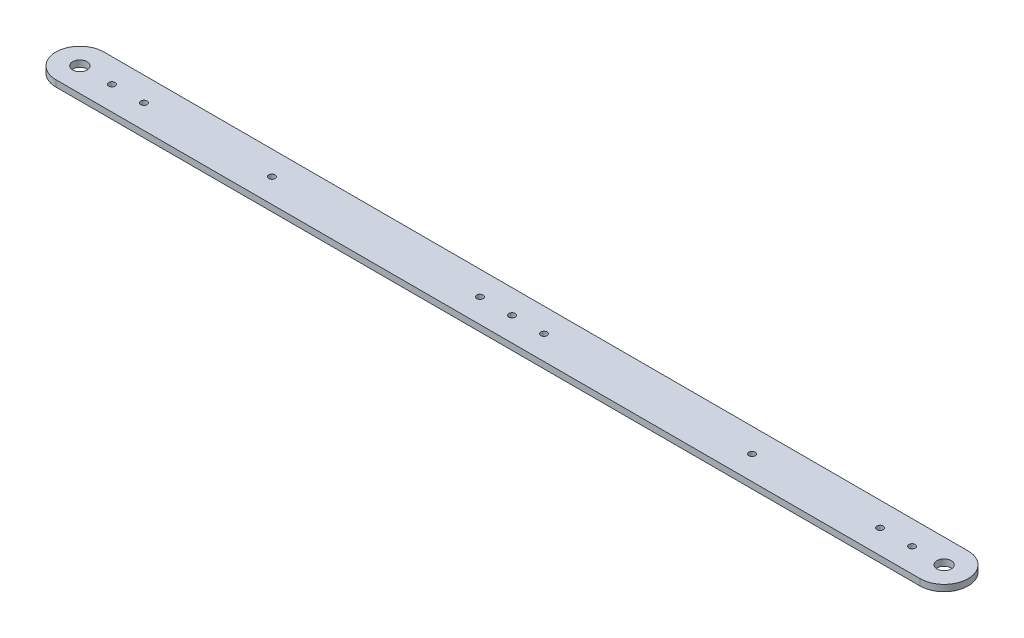
ISO-10303-21;
HEADER;
FILE_DESCRIPTION(('STEP AP214'),'2;1');
FILE_NAME('part.step','',(''),(''),'','','');
FILE_SCHEMA(('AUTOMOTIVE_DESIGN { 1 0 10303 214 1 1 1 1 }'));
ENDSEC;
DATA;
#1=APPLICATION_CONTEXT('core data for automotive mechanical design processes');
#2=APPLICATION_PROTOCOL_DEFINITION('international standard','automotive_design',2000,#1);
#3=PRODUCT_CONTEXT('',#1,'mechanical');
#4=PRODUCT('Part','Part','',(#3));
#5=PRODUCT_RELATED_PRODUCT_CATEGORY('part','',(#4));
#6=PRODUCT_DEFINITION_FORMATION('','',#4);
#7=PRODUCT_DEFINITION_CONTEXT('part definition',#1,'design');
#8=PRODUCT_DEFINITION('design','',#6,#7);
#9=PRODUCT_DEFINITION_SHAPE('','',#8);
#10=(LENGTH_UNIT() NAMED_UNIT(*) SI_UNIT(.MILLI.,.METRE.));
#11=(NAMED_UNIT(*) PLANE_ANGLE_UNIT() SI_UNIT($,.RADIAN.));
#12=(NAMED_UNIT(*) SI_UNIT($,.STERADIAN.) SOLID_ANGLE_UNIT());
#13=UNCERTAINTY_MEASURE_WITH_UNIT(LENGTH_MEASURE(1.E-05),#10,'distance_accuracy_value','');
#14=(GEOMETRIC_REPRESENTATION_CONTEXT(3) GLOBAL_UNCERTAINTY_ASSIGNED_CONTEXT((#13)) GLOBAL_UNIT_ASSIGNED_CONTEXT((#10,
#11,#12)) REPRESENTATION_CONTEXT('',''));
#15=CARTESIAN_POINT('',(0.,0.,0.));
#16=DIRECTION('',(0.,0.,1.));
#17=DIRECTION('',(1.,0.,0.));
#18=AXIS2_PLACEMENT_3D('',#15,#16,#17);
#19=CARTESIAN_POINT('',(-270.,4.,0.));
#20=DIRECTION('',(0.,-1.,0.));
#21=DIRECTION('',(0.,0.,-1.));
#22=AXIS2_PLACEMENT_3D('',#19,#20,#21);
#23=PLANE('',#22);
#24=CARTESIAN_POINT('',(-270.,4.,0.));
#25=DIRECTION('',(0.,1.,0.));
#26=DIRECTION('',(0.,0.,-1.));
#27=AXIS2_PLACEMENT_3D('',#24,#25,#26);
#28=CIRCLE('',#27,15.);
#29=CARTESIAN_POINT('',(-270.,4.,-15.));
#30=VERTEX_POINT('',#29);
#31=CARTESIAN_POINT('',(-270.,4.,15.0000000000001));
#32=VERTEX_POINT('',#31);
#33=EDGE_CURVE('E84',#30,#32,#28,.T.);
#34=ORIENTED_EDGE('',*,*,#33,.T.);
#35=DIRECTION('',(1.,0.,0.));
#36=VECTOR('',#35,1.);
#37=CARTESIAN_POINT('',(270.,4.,15.));
#38=LINE('',#37,#36);
#39=CARTESIAN_POINT('',(270.,4.,15.));
#40=VERTEX_POINT('',#39);
#41=EDGE_CURVE('E79',#32,#40,#38,.T.);
#42=ORIENTED_EDGE('',*,*,#41,.T.);
#43=CARTESIAN_POINT('',(270.,4.,0.));
#44=DIRECTION('',(0.,1.,0.));
#45=DIRECTION('',(0.,0.,-1.));
#46=AXIS2_PLACEMENT_3D('',#43,#44,#45);
#47=CIRCLE('',#46,15.);
#48=CARTESIAN_POINT('',(270.,4.,-15.));
#49=VERTEX_POINT('',#48);
#50=EDGE_CURVE('E82',#40,#49,#47,.T.);
#51=ORIENTED_EDGE('',*,*,#50,.T.);
#52=DIRECTION('',(-1.,0.,0.));
#53=VECTOR('',#52,1.);
#54=CARTESIAN_POINT('',(-270.,4.,-15.));
#55=LINE('',#54,#53);
#56=EDGE_CURVE('E49',#49,#30,#55,.T.);
#57=ORIENTED_EDGE('',*,*,#56,.T.);
#58=EDGE_LOOP('',(#34,#42,#51,#57));
#59=FACE_BOUND('',#58,.T.);
#60=CARTESIAN_POINT('',(-270.,4.,0.));
#61=DIRECTION('',(0.,1.,0.));
#62=DIRECTION('',(0.,0.,1.));
#63=AXIS2_PLACEMENT_3D('',#60,#61,#62);
#64=CIRCLE('',#63,4.50000000000003);
#65=CARTESIAN_POINT('',(-270.,4.,4.50000000000006));
#66=VERTEX_POINT('',#65);
#67=EDGE_CURVE('E99',#66,#66,#64,.T.);
#68=ORIENTED_EDGE('',*,*,#67,.F.);
#69=EDGE_LOOP('',(#68));
#70=FACE_BOUND('',#69,.T.);
#71=CARTESIAN_POINT('',(150.,4.,0.));
#72=DIRECTION('',(0.,1.,0.));
#73=DIRECTION('',(0.,0.,1.));
#74=AXIS2_PLACEMENT_3D('',#71,#72,#73);
#75=CIRCLE('',#74,2.);
#76=CARTESIAN_POINT('',(150.,4.,2.));
#77=VERTEX_POINT('',#76);
#78=EDGE_CURVE('E114',#77,#77,#75,.T.);
#79=ORIENTED_EDGE('',*,*,#78,.F.);
#80=EDGE_LOOP('',(#79));
#81=FACE_BOUND('',#80,.T.);
#82=CARTESIAN_POINT('',(270.,4.,0.));
#83=DIRECTION('',(0.,1.,0.));
#84=DIRECTION('',(0.,0.,1.));
#85=AXIS2_PLACEMENT_3D('',#82,#83,#84);
#86=CIRCLE('',#85,4.50000000000001);
#87=CARTESIAN_POINT('',(270.,4.,4.49999999999998));
#88=VERTEX_POINT('',#87);
#89=EDGE_CURVE('E120',#88,#88,#86,.T.);
#90=ORIENTED_EDGE('',*,*,#89,.F.);
#91=EDGE_LOOP('',(#90));
#92=FACE_BOUND('',#91,.T.);
#93=CARTESIAN_POINT('',(0.,4.,0.));
#94=DIRECTION('',(0.,1.,0.));
#95=DIRECTION('',(0.,0.,1.));
#96=AXIS2_PLACEMENT_3D('',#93,#94,#95);
#97=CIRCLE('',#96,2.);
#98=CARTESIAN_POINT('',(0.,4.,2.));
#99=VERTEX_POINT('',#98);
#100=EDGE_CURVE('E126',#99,#99,#97,.T.);
#101=ORIENTED_EDGE('',*,*,#100,.F.);
#102=EDGE_LOOP('',(#101));
#103=FACE_BOUND('',#102,.T.);
#104=CARTESIAN_POINT('',(-250.,4.,0.));
#105=DIRECTION('',(0.,1.,0.));
#106=DIRECTION('',(0.,0.,1.));
#107=AXIS2_PLACEMENT_3D('',#104,#105,#106);
#108=CIRCLE('',#107,2.);
#109=CARTESIAN_POINT('',(-250.,4.,2.00000000000003));
#110=VERTEX_POINT('',#109);
#111=EDGE_CURVE('E132',#110,#110,#108,.T.);
#112=ORIENTED_EDGE('',*,*,#111,.F.);
#113=EDGE_LOOP('',(#112));
#114=FACE_BOUND('',#113,.T.);
#115=CARTESIAN_POINT('',(-150.,4.,0.));
#116=DIRECTION('',(0.,1.,0.));
#117=DIRECTION('',(0.,0.,1.));
#118=AXIS2_PLACEMENT_3D('',#115,#116,#117);
#119=CIRCLE('',#118,2.);
#120=CARTESIAN_POINT('',(-150.,4.,2.00000000000001));
#121=VERTEX_POINT('',#120);
#122=EDGE_CURVE('E138',#121,#121,#119,.T.);
#123=ORIENTED_EDGE('',*,*,#122,.F.);
#124=EDGE_LOOP('',(#123));
#125=FACE_BOUND('',#124,.T.);
#126=CARTESIAN_POINT('',(-230.,4.,0.));
#127=DIRECTION('',(0.,1.,0.));
#128=DIRECTION('',(0.,0.,1.));
#129=AXIS2_PLACEMENT_3D('',#126,#127,#128);
#130=CIRCLE('',#129,2.);
#131=CARTESIAN_POINT('',(-230.,4.,2.00000000000002));
#132=VERTEX_POINT('',#131);
#133=EDGE_CURVE('E144',#132,#132,#130,.T.);
#134=ORIENTED_EDGE('',*,*,#133,.F.);
#135=EDGE_LOOP('',(#134));
#136=FACE_BOUND('',#135,.T.);
#137=CARTESIAN_POINT('',(-20.,4.,0.));
#138=DIRECTION('',(0.,1.,0.));
#139=DIRECTION('',(0.,0.,1.));
#140=AXIS2_PLACEMENT_3D('',#137,#138,#139);
#141=CIRCLE('',#140,2.);
#142=CARTESIAN_POINT('',(-20.,4.,2.));
#143=VERTEX_POINT('',#142);
#144=EDGE_CURVE('E150',#143,#143,#141,.T.);
#145=ORIENTED_EDGE('',*,*,#144,.F.);
#146=EDGE_LOOP('',(#145));
#147=FACE_BOUND('',#146,.T.);
#148=CARTESIAN_POINT('',(230.,4.,0.));
#149=DIRECTION('',(0.,1.,0.));
#150=DIRECTION('',(0.,0.,-1.));
#151=AXIS2_PLACEMENT_3D('',#148,#149,#150);
#152=CIRCLE('',#151,2.);
#153=CARTESIAN_POINT('',(230.,4.,-1.99999999999997));
#154=VERTEX_POINT('',#153);
#155=EDGE_CURVE('E156',#154,#154,#152,.T.);
#156=ORIENTED_EDGE('',*,*,#155,.F.);
#157=EDGE_LOOP('',(#156));
#158=FACE_BOUND('',#157,.T.);
#159=CARTESIAN_POINT('',(250.,4.,0.));
#160=DIRECTION('',(0.,1.,0.));
#161=DIRECTION('',(0.,0.,-1.));
#162=AXIS2_PLACEMENT_3D('',#159,#160,#161);
#163=CIRCLE('',#162,2.);
#164=CARTESIAN_POINT('',(250.,4.,-1.99999999999997));
#165=VERTEX_POINT('',#164);
#166=EDGE_CURVE('E162',#165,#165,#163,.T.);
#167=ORIENTED_EDGE('',*,*,#166,.F.);
#168=EDGE_LOOP('',(#167));
#169=FACE_BOUND('',#168,.T.);
#170=CARTESIAN_POINT('',(20.,4.,0.));
#171=DIRECTION('',(0.,1.,0.));
#172=DIRECTION('',(0.,0.,-1.));
#173=AXIS2_PLACEMENT_3D('',#170,#171,#172);
#174=CIRCLE('',#173,2.);
#175=CARTESIAN_POINT('',(20.,4.,-2.));
#176=VERTEX_POINT('',#175);
#177=EDGE_CURVE('E168',#176,#176,#174,.T.);
#178=ORIENTED_EDGE('',*,*,#177,.F.);
#179=EDGE_LOOP('',(#178));
#180=FACE_BOUND('',#179,.T.);
#181=ADVANCED_FACE('F32',(#59,#70,#81,#92,#103,#114,#125,#136,#147,#158,#169,#180),#23,.F.);
#182=CARTESIAN_POINT('',(-270.,0.,0.));
#183=DIRECTION('',(0.,-1.,0.));
#184=DIRECTION('',(0.,0.,-1.));
#185=AXIS2_PLACEMENT_3D('',#182,#183,#184);
#186=PLANE('',#185);
#187=CARTESIAN_POINT('',(250.,0.,0.));
#188=DIRECTION('',(0.,1.,0.));
#189=DIRECTION('',(0.,0.,-1.));
#190=AXIS2_PLACEMENT_3D('',#187,#188,#189);
#191=CIRCLE('',#190,2.);
#192=CARTESIAN_POINT('',(250.,0.,-1.99999999999997));
#193=VERTEX_POINT('',#192);
#194=EDGE_CURVE('E165',#193,#193,#191,.T.);
#195=ORIENTED_EDGE('',*,*,#194,.T.);
#196=EDGE_LOOP('',(#195));
#197=FACE_BOUND('',#196,.T.);
#198=CARTESIAN_POINT('',(-20.,0.,0.));
#199=DIRECTION('',(0.,1.,0.));
#200=DIRECTION('',(0.,0.,1.));
#201=AXIS2_PLACEMENT_3D('',#198,#199,#200);
#202=CIRCLE('',#201,2.);
#203=CARTESIAN_POINT('',(-20.,0.,2.));
#204=VERTEX_POINT('',#203);
#205=EDGE_CURVE('E153',#204,#204,#202,.T.);
#206=ORIENTED_EDGE('',*,*,#205,.T.);
#207=EDGE_LOOP('',(#206));
#208=FACE_BOUND('',#207,.T.);
#209=CARTESIAN_POINT('',(-150.,0.,0.));
#210=DIRECTION('',(0.,1.,0.));
#211=DIRECTION('',(0.,0.,1.));
#212=AXIS2_PLACEMENT_3D('',#209,#210,#211);
#213=CIRCLE('',#212,2.);
#214=CARTESIAN_POINT('',(-150.,0.,2.00000000000001));
#215=VERTEX_POINT('',#214);
#216=EDGE_CURVE('E141',#215,#215,#213,.T.);
#217=ORIENTED_EDGE('',*,*,#216,.T.);
#218=EDGE_LOOP('',(#217));
#219=FACE_BOUND('',#218,.T.);
#220=CARTESIAN_POINT('',(0.,0.,0.));
#221=DIRECTION('',(0.,1.,0.));
#222=DIRECTION('',(0.,0.,1.));
#223=AXIS2_PLACEMENT_3D('',#220,#221,#222);
#224=CIRCLE('',#223,2.);
#225=CARTESIAN_POINT('',(0.,0.,2.));
#226=VERTEX_POINT('',#225);
#227=EDGE_CURVE('E129',#226,#226,#224,.T.);
#228=ORIENTED_EDGE('',*,*,#227,.T.);
#229=EDGE_LOOP('',(#228));
#230=FACE_BOUND('',#229,.T.);
#231=CARTESIAN_POINT('',(150.,0.,0.));
#232=DIRECTION('',(0.,1.,0.));
#233=DIRECTION('',(0.,0.,1.));
#234=AXIS2_PLACEMENT_3D('',#231,#232,#233);
#235=CIRCLE('',#234,2.);
#236=CARTESIAN_POINT('',(150.,0.,2.));
#237=VERTEX_POINT('',#236);
#238=EDGE_CURVE('E117',#237,#237,#235,.T.);
#239=ORIENTED_EDGE('',*,*,#238,.T.);
#240=EDGE_LOOP('',(#239));
#241=FACE_BOUND('',#240,.T.);
#242=CARTESIAN_POINT('',(-270.,0.,0.));
#243=DIRECTION('',(0.,1.,0.));
#244=DIRECTION('',(0.,0.,-1.));
#245=AXIS2_PLACEMENT_3D('',#242,#243,#244);
#246=CIRCLE('',#245,15.);
#247=CARTESIAN_POINT('',(-270.,0.,-15.));
#248=VERTEX_POINT('',#247);
#249=CARTESIAN_POINT('',(-270.,0.,15.0000000000001));
#250=VERTEX_POINT('',#249);
#251=EDGE_CURVE('E96',#248,#250,#246,.T.);
#252=ORIENTED_EDGE('',*,*,#251,.F.);
#253=DIRECTION('',(-1.,0.,0.));
#254=VECTOR('',#253,1.);
#255=CARTESIAN_POINT('',(-270.,0.,-15.));
#256=LINE('',#255,#254);
#257=CARTESIAN_POINT('',(270.,0.,-15.));
#258=VERTEX_POINT('',#257);
#259=EDGE_CURVE('E72',#258,#248,#256,.T.);
#260=ORIENTED_EDGE('',*,*,#259,.F.);
#261=CARTESIAN_POINT('',(270.,0.,0.));
#262=DIRECTION('',(0.,1.,0.));
#263=DIRECTION('',(0.,0.,-1.));
#264=AXIS2_PLACEMENT_3D('',#261,#262,#263);
#265=CIRCLE('',#264,15.);
#266=CARTESIAN_POINT('',(270.,0.,15.));
#267=VERTEX_POINT('',#266);
#268=EDGE_CURVE('E66',#267,#258,#265,.T.);
#269=ORIENTED_EDGE('',*,*,#268,.F.);
#270=DIRECTION('',(1.,0.,0.));
#271=VECTOR('',#270,1.);
#272=CARTESIAN_POINT('',(270.,0.,15.));
#273=LINE('',#272,#271);
#274=EDGE_CURVE('E88',#250,#267,#273,.T.);
#275=ORIENTED_EDGE('',*,*,#274,.F.);
#276=EDGE_LOOP('',(#252,#260,#269,#275));
#277=FACE_BOUND('',#276,.T.);
#278=CARTESIAN_POINT('',(-270.,0.,0.));
#279=DIRECTION('',(0.,1.,0.));
#280=DIRECTION('',(0.,0.,1.));
#281=AXIS2_PLACEMENT_3D('',#278,#279,#280);
#282=CIRCLE('',#281,4.50000000000003);
#283=CARTESIAN_POINT('',(-270.,0.,4.50000000000006));
#284=VERTEX_POINT('',#283);
#285=EDGE_CURVE('E111',#284,#284,#282,.T.);
#286=ORIENTED_EDGE('',*,*,#285,.T.);
#287=EDGE_LOOP('',(#286));
#288=FACE_BOUND('',#287,.T.);
#289=CARTESIAN_POINT('',(270.,0.,0.));
#290=DIRECTION('',(0.,1.,0.));
#291=DIRECTION('',(0.,0.,1.));
#292=AXIS2_PLACEMENT_3D('',#289,#290,#291);
#293=CIRCLE('',#292,4.50000000000001);
#294=CARTESIAN_POINT('',(270.,0.,4.49999999999998));
#295=VERTEX_POINT('',#294);
#296=EDGE_CURVE('E123',#295,#295,#293,.T.);
#297=ORIENTED_EDGE('',*,*,#296,.T.);
#298=EDGE_LOOP('',(#297));
#299=FACE_BOUND('',#298,.T.);
#300=CARTESIAN_POINT('',(-250.,0.,0.));
#301=DIRECTION('',(0.,1.,0.));
#302=DIRECTION('',(0.,0.,1.));
#303=AXIS2_PLACEMENT_3D('',#300,#301,#302);
#304=CIRCLE('',#303,2.);
#305=CARTESIAN_POINT('',(-250.,0.,2.00000000000003));
#306=VERTEX_POINT('',#305);
#307=EDGE_CURVE('E135',#306,#306,#304,.T.);
#308=ORIENTED_EDGE('',*,*,#307,.T.);
#309=EDGE_LOOP('',(#308));
#310=FACE_BOUND('',#309,.T.);
#311=CARTESIAN_POINT('',(-230.,0.,0.));
#312=DIRECTION('',(0.,1.,0.));
#313=DIRECTION('',(0.,0.,1.));
#314=AXIS2_PLACEMENT_3D('',#311,#312,#313);
#315=CIRCLE('',#314,2.);
#316=CARTESIAN_POINT('',(-230.,0.,2.00000000000002));
#317=VERTEX_POINT('',#316);
#318=EDGE_CURVE('E147',#317,#317,#315,.T.);
#319=ORIENTED_EDGE('',*,*,#318,.T.);
#320=EDGE_LOOP('',(#319));
#321=FACE_BOUND('',#320,.T.);
#322=CARTESIAN_POINT('',(230.,0.,0.));
#323=DIRECTION('',(0.,1.,0.));
#324=DIRECTION('',(0.,0.,-1.));
#325=AXIS2_PLACEMENT_3D('',#322,#323,#324);
#326=CIRCLE('',#325,2.);
#327=CARTESIAN_POINT('',(230.,0.,-1.99999999999997));
#328=VERTEX_POINT('',#327);
#329=EDGE_CURVE('E159',#328,#328,#326,.T.);
#330=ORIENTED_EDGE('',*,*,#329,.T.);
#331=EDGE_LOOP('',(#330));
#332=FACE_BOUND('',#331,.T.);
#333=CARTESIAN_POINT('',(20.,0.,0.));
#334=DIRECTION('',(0.,1.,0.));
#335=DIRECTION('',(0.,0.,-1.));
#336=AXIS2_PLACEMENT_3D('',#333,#334,#335);
#337=CIRCLE('',#336,2.);
#338=CARTESIAN_POINT('',(20.,0.,-2.));
#339=VERTEX_POINT('',#338);
#340=EDGE_CURVE('E171',#339,#339,#337,.T.);
#341=ORIENTED_EDGE('',*,*,#340,.T.);
#342=EDGE_LOOP('',(#341));
#343=FACE_BOUND('',#342,.T.);
#344=ADVANCED_FACE('F107',(#197,#208,#219,#230,#241,#277,#288,#299,#310,#321,#332,#343),#186,.T.);
#345=CARTESIAN_POINT('',(-270.,4.,0.));
#346=DIRECTION('',(0.,-1.,0.));
#347=DIRECTION('',(0.,0.,-1.));
#348=AXIS2_PLACEMENT_3D('',#345,#346,#347);
#349=CYLINDRICAL_SURFACE('',#348,15.);
#350=ORIENTED_EDGE('',*,*,#251,.T.);
#351=DIRECTION('',(0.,-1.,0.));
#352=VECTOR('',#351,1.);
#353=CARTESIAN_POINT('',(-270.,4.,15.0000000000001));
#354=LINE('',#353,#352);
#355=EDGE_CURVE('E11',#32,#250,#354,.T.);
#356=ORIENTED_EDGE('',*,*,#355,.F.);
#357=ORIENTED_EDGE('',*,*,#33,.F.);
#358=DIRECTION('',(0.,-1.,0.));
#359=VECTOR('',#358,1.);
#360=CARTESIAN_POINT('',(-270.,4.,-15.));
#361=LINE('',#360,#359);
#362=EDGE_CURVE('E92',#30,#248,#361,.T.);
#363=ORIENTED_EDGE('',*,*,#362,.T.);
#364=EDGE_LOOP('',(#350,#356,#357,#363));
#365=FACE_BOUND('',#364,.T.);
#366=ADVANCED_FACE('F34',(#365),#349,.T.);
#367=CARTESIAN_POINT('',(270.,4.,15.));
#368=DIRECTION('',(0.,0.,-1.));
#369=DIRECTION('',(-1.,0.,0.));
#370=AXIS2_PLACEMENT_3D('',#367,#368,#369);
#371=PLANE('',#370);
#372=ORIENTED_EDGE('',*,*,#274,.T.);
#373=DIRECTION('',(0.,-1.,0.));
#374=VECTOR('',#373,1.);
#375=CARTESIAN_POINT('',(270.,4.,15.));
#376=LINE('',#375,#374);
#377=EDGE_CURVE('E41',#40,#267,#376,.T.);
#378=ORIENTED_EDGE('',*,*,#377,.F.);
#379=ORIENTED_EDGE('',*,*,#41,.F.);
#380=ORIENTED_EDGE('',*,*,#355,.T.);
#381=EDGE_LOOP('',(#372,#378,#379,#380));
#382=FACE_BOUND('',#381,.T.);
#383=ADVANCED_FACE('F87',(#382),#371,.F.);
#384=CARTESIAN_POINT('',(270.,4.,0.));
#385=DIRECTION('',(0.,-1.,0.));
#386=DIRECTION('',(0.,0.,-1.));
#387=AXIS2_PLACEMENT_3D('',#384,#385,#386);
#388=CYLINDRICAL_SURFACE('',#387,15.);
#389=ORIENTED_EDGE('',*,*,#268,.T.);
#390=DIRECTION('',(0.,-1.,0.));
#391=VECTOR('',#390,1.);
#392=CARTESIAN_POINT('',(270.,4.,-15.));
#393=LINE('',#392,#391);
#394=EDGE_CURVE('E89',#49,#258,#393,.T.);
#395=ORIENTED_EDGE('',*,*,#394,.F.);
#396=ORIENTED_EDGE('',*,*,#50,.F.);
#397=ORIENTED_EDGE('',*,*,#377,.T.);
#398=EDGE_LOOP('',(#389,#395,#396,#397));
#399=FACE_BOUND('',#398,.T.);
#400=ADVANCED_FACE('F90',(#399),#388,.T.);
#401=CARTESIAN_POINT('',(-270.,4.,-15.));
#402=DIRECTION('',(0.,0.,1.));
#403=DIRECTION('',(1.,0.,0.));
#404=AXIS2_PLACEMENT_3D('',#401,#402,#403);
#405=PLANE('',#404);
#406=ORIENTED_EDGE('',*,*,#259,.T.);
#407=ORIENTED_EDGE('',*,*,#362,.F.);
#408=ORIENTED_EDGE('',*,*,#56,.F.);
#409=ORIENTED_EDGE('',*,*,#394,.T.);
#410=EDGE_LOOP('',(#406,#407,#408,#409));
#411=FACE_BOUND('',#410,.T.);
#412=ADVANCED_FACE('F104',(#411),#405,.F.);
#413=CARTESIAN_POINT('',(-270.,4.,0.));
#414=DIRECTION('',(0.,-1.,0.));
#415=DIRECTION('',(0.,0.,-1.));
#416=AXIS2_PLACEMENT_3D('',#413,#414,#415);
#417=CYLINDRICAL_SURFACE('',#416,4.50000000000003);
#418=ORIENTED_EDGE('',*,*,#67,.T.);
#419=EDGE_LOOP('',(#418));
#420=FACE_BOUND('',#419,.T.);
#421=ORIENTED_EDGE('',*,*,#285,.F.);
#422=EDGE_LOOP('',(#421));
#423=FACE_BOUND('',#422,.T.);
#424=ADVANCED_FACE('F188',(#420,#423),#417,.F.);
#425=CARTESIAN_POINT('',(150.,4.,0.));
#426=DIRECTION('',(0.,-1.,0.));
#427=DIRECTION('',(0.,0.,-1.));
#428=AXIS2_PLACEMENT_3D('',#425,#426,#427);
#429=CYLINDRICAL_SURFACE('',#428,2.);
#430=ORIENTED_EDGE('',*,*,#78,.T.);
#431=EDGE_LOOP('',(#430));
#432=FACE_BOUND('',#431,.T.);
#433=ORIENTED_EDGE('',*,*,#238,.F.);
#434=EDGE_LOOP('',(#433));
#435=FACE_BOUND('',#434,.T.);
#436=ADVANCED_FACE('F234',(#432,#435),#429,.F.);
#437=CARTESIAN_POINT('',(270.,4.,0.));
#438=DIRECTION('',(0.,-1.,0.));
#439=DIRECTION('',(0.,0.,-1.));
#440=AXIS2_PLACEMENT_3D('',#437,#438,#439);
#441=CYLINDRICAL_SURFACE('',#440,4.50000000000001);
#442=ORIENTED_EDGE('',*,*,#89,.T.);
#443=EDGE_LOOP('',(#442));
#444=FACE_BOUND('',#443,.T.);
#445=ORIENTED_EDGE('',*,*,#296,.F.);
#446=EDGE_LOOP('',(#445));
#447=FACE_BOUND('',#446,.T.);
#448=ADVANCED_FACE('F242',(#444,#447),#441,.F.);
#449=CARTESIAN_POINT('',(0.,4.,0.));
#450=DIRECTION('',(0.,-1.,0.));
#451=DIRECTION('',(0.,0.,-1.));
#452=AXIS2_PLACEMENT_3D('',#449,#450,#451);
#453=CYLINDRICAL_SURFACE('',#452,2.);
#454=ORIENTED_EDGE('',*,*,#100,.T.);
#455=EDGE_LOOP('',(#454));
#456=FACE_BOUND('',#455,.T.);
#457=ORIENTED_EDGE('',*,*,#227,.F.);
#458=EDGE_LOOP('',(#457));
#459=FACE_BOUND('',#458,.T.);
#460=ADVANCED_FACE('F250',(#456,#459),#453,.F.);
#461=CARTESIAN_POINT('',(-250.,4.,0.));
#462=DIRECTION('',(0.,-1.,0.));
#463=DIRECTION('',(0.,0.,-1.));
#464=AXIS2_PLACEMENT_3D('',#461,#462,#463);
#465=CYLINDRICAL_SURFACE('',#464,2.);
#466=ORIENTED_EDGE('',*,*,#111,.T.);
#467=EDGE_LOOP('',(#466));
#468=FACE_BOUND('',#467,.T.);
#469=ORIENTED_EDGE('',*,*,#307,.F.);
#470=EDGE_LOOP('',(#469));
#471=FACE_BOUND('',#470,.T.);
#472=ADVANCED_FACE('F259',(#468,#471),#465,.F.);
#473=CARTESIAN_POINT('',(-150.,4.,0.));
#474=DIRECTION('',(0.,-1.,0.));
#475=DIRECTION('',(0.,0.,-1.));
#476=AXIS2_PLACEMENT_3D('',#473,#474,#475);
#477=CYLINDRICAL_SURFACE('',#476,2.);
#478=ORIENTED_EDGE('',*,*,#122,.T.);
#479=EDGE_LOOP('',(#478));
#480=FACE_BOUND('',#479,.T.);
#481=ORIENTED_EDGE('',*,*,#216,.F.);
#482=EDGE_LOOP('',(#481));
#483=FACE_BOUND('',#482,.T.);
#484=ADVANCED_FACE('F268',(#480,#483),#477,.F.);
#485=CARTESIAN_POINT('',(-230.,4.,0.));
#486=DIRECTION('',(0.,-1.,0.));
#487=DIRECTION('',(0.,0.,-1.));
#488=AXIS2_PLACEMENT_3D('',#485,#486,#487);
#489=CYLINDRICAL_SURFACE('',#488,2.);
#490=ORIENTED_EDGE('',*,*,#133,.T.);
#491=EDGE_LOOP('',(#490));
#492=FACE_BOUND('',#491,.T.);
#493=ORIENTED_EDGE('',*,*,#318,.F.);
#494=EDGE_LOOP('',(#493));
#495=FACE_BOUND('',#494,.T.);
#496=ADVANCED_FACE('F277',(#492,#495),#489,.F.);
#497=CARTESIAN_POINT('',(-20.,4.,0.));
#498=DIRECTION('',(0.,-1.,0.));
#499=DIRECTION('',(0.,0.,-1.));
#500=AXIS2_PLACEMENT_3D('',#497,#498,#499);
#501=CYLINDRICAL_SURFACE('',#500,2.);
#502=ORIENTED_EDGE('',*,*,#144,.T.);
#503=EDGE_LOOP('',(#502));
#504=FACE_BOUND('',#503,.T.);
#505=ORIENTED_EDGE('',*,*,#205,.F.);
#506=EDGE_LOOP('',(#505));
#507=FACE_BOUND('',#506,.T.);
#508=ADVANCED_FACE('F286',(#504,#507),#501,.F.);
#509=CARTESIAN_POINT('',(230.,4.,0.));
#510=DIRECTION('',(0.,-1.,0.));
#511=DIRECTION('',(0.,0.,-1.));
#512=AXIS2_PLACEMENT_3D('',#509,#510,#511);
#513=CYLINDRICAL_SURFACE('',#512,2.);
#514=ORIENTED_EDGE('',*,*,#155,.T.);
#515=EDGE_LOOP('',(#514));
#516=FACE_BOUND('',#515,.T.);
#517=ORIENTED_EDGE('',*,*,#329,.F.);
#518=EDGE_LOOP('',(#517));
#519=FACE_BOUND('',#518,.T.);
#520=ADVANCED_FACE('F295',(#516,#519),#513,.F.);
#521=CARTESIAN_POINT('',(250.,4.,0.));
#522=DIRECTION('',(0.,-1.,0.));
#523=DIRECTION('',(0.,0.,-1.));
#524=AXIS2_PLACEMENT_3D('',#521,#522,#523);
#525=CYLINDRICAL_SURFACE('',#524,2.);
#526=ORIENTED_EDGE('',*,*,#166,.T.);
#527=EDGE_LOOP('',(#526));
#528=FACE_BOUND('',#527,.T.);
#529=ORIENTED_EDGE('',*,*,#194,.F.);
#530=EDGE_LOOP('',(#529));
#531=FACE_BOUND('',#530,.T.);
#532=ADVANCED_FACE('F304',(#528,#531),#525,.F.);
#533=CARTESIAN_POINT('',(20.,4.,0.));
#534=DIRECTION('',(0.,-1.,0.));
#535=DIRECTION('',(0.,0.,-1.));
#536=AXIS2_PLACEMENT_3D('',#533,#534,#535);
#537=CYLINDRICAL_SURFACE('',#536,2.);
#538=ORIENTED_EDGE('',*,*,#177,.T.);
#539=EDGE_LOOP('',(#538));
#540=FACE_BOUND('',#539,.T.);
#541=ORIENTED_EDGE('',*,*,#340,.F.);
#542=EDGE_LOOP('',(#541));
#543=FACE_BOUND('',#542,.T.);
#544=ADVANCED_FACE('F177',(#540,#543),#537,.F.);
#545=CLOSED_SHELL('',(#181,#344,#366,#383,#400,#412,#424,#436,#448,#460,#472,#484,#496,#508,
#520,#532,#544));
#546=MANIFOLD_SOLID_BREP('B2',#545);
#547=ADVANCED_BREP_SHAPE_REPRESENTATION('',(#18,#546),#14);
#548=SHAPE_DEFINITION_REPRESENTATION(#9,#547);
ENDSEC;
END-ISO-10303-21;
